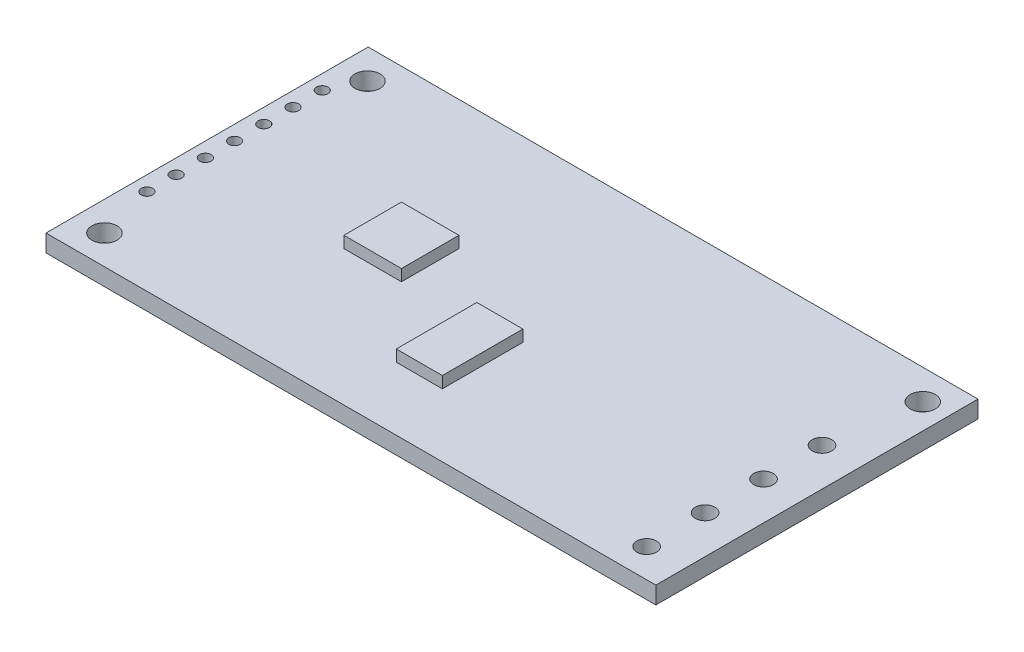
ISO-10303-21;
HEADER;
FILE_DESCRIPTION(('STEP AP214'),'2;1');
FILE_NAME('part.step','',(''),(''),'','','');
FILE_SCHEMA(('AUTOMOTIVE_DESIGN { 1 0 10303 214 1 1 1 1 }'));
ENDSEC;
DATA;
#1=APPLICATION_CONTEXT('core data for automotive mechanical design processes');
#2=APPLICATION_PROTOCOL_DEFINITION('international standard','automotive_design',2000,#1);
#3=PRODUCT_CONTEXT('',#1,'mechanical');
#4=PRODUCT('Part','Part','',(#3));
#5=PRODUCT_RELATED_PRODUCT_CATEGORY('part','',(#4));
#6=PRODUCT_DEFINITION_FORMATION('','',#4);
#7=PRODUCT_DEFINITION_CONTEXT('part definition',#1,'design');
#8=PRODUCT_DEFINITION('design','',#6,#7);
#9=PRODUCT_DEFINITION_SHAPE('','',#8);
#10=(LENGTH_UNIT() NAMED_UNIT(*) SI_UNIT(.MILLI.,.METRE.));
#11=(NAMED_UNIT(*) PLANE_ANGLE_UNIT() SI_UNIT($,.RADIAN.));
#12=(NAMED_UNIT(*) SI_UNIT($,.STERADIAN.) SOLID_ANGLE_UNIT());
#13=UNCERTAINTY_MEASURE_WITH_UNIT(LENGTH_MEASURE(1.E-05),#10,'distance_accuracy_value','');
#14=(GEOMETRIC_REPRESENTATION_CONTEXT(3) GLOBAL_UNCERTAINTY_ASSIGNED_CONTEXT((#13)) GLOBAL_UNIT_ASSIGNED_CONTEXT((#10,
#11,#12)) REPRESENTATION_CONTEXT('',''));
#15=CARTESIAN_POINT('',(0.,0.,0.));
#16=DIRECTION('',(0.,0.,1.));
#17=DIRECTION('',(1.,0.,0.));
#18=AXIS2_PLACEMENT_3D('',#15,#16,#17);
#19=CARTESIAN_POINT('',(0.,1.5,0.));
#20=DIRECTION('',(0.,-1.,0.));
#21=DIRECTION('',(0.,0.,-1.));
#22=AXIS2_PLACEMENT_3D('',#19,#20,#21);
#23=PLANE('',#22);
#24=DIRECTION('',(0.,0.,-1.));
#25=VECTOR('',#24,1.);
#26=CARTESIAN_POINT('',(-7.38162653581105,1.5,-2.77279885535369));
#27=LINE('',#26,#25);
#28=CARTESIAN_POINT('',(-7.38162653581105,1.5,2.22720114464631));
#29=VERTEX_POINT('',#28);
#30=CARTESIAN_POINT('',(-7.38162653581105,1.5,-2.77279885535369));
#31=VERTEX_POINT('',#30);
#32=EDGE_CURVE('E143',#29,#31,#27,.T.);
#33=ORIENTED_EDGE('',*,*,#32,.F.);
#34=DIRECTION('',(1.,0.,0.));
#35=VECTOR('',#34,1.);
#36=CARTESIAN_POINT('',(-12.381626535811,1.5,2.22720114464631));
#37=LINE('',#36,#35);
#38=CARTESIAN_POINT('',(-12.381626535811,1.5,2.22720114464631));
#39=VERTEX_POINT('',#38);
#40=EDGE_CURVE('E156',#39,#29,#37,.T.);
#41=ORIENTED_EDGE('',*,*,#40,.F.);
#42=DIRECTION('',(0.,0.,1.));
#43=VECTOR('',#42,1.);
#44=CARTESIAN_POINT('',(-12.381626535811,1.5,-2.77279885535369));
#45=LINE('',#44,#43);
#46=CARTESIAN_POINT('',(-12.381626535811,1.5,-2.77279885535369));
#47=VERTEX_POINT('',#46);
#48=EDGE_CURVE('E165',#47,#39,#45,.T.);
#49=ORIENTED_EDGE('',*,*,#48,.F.);
#50=DIRECTION('',(-1.,0.,0.));
#51=VECTOR('',#50,1.);
#52=CARTESIAN_POINT('',(-12.381626535811,1.5,-2.77279885535369));
#53=LINE('',#52,#51);
#54=EDGE_CURVE('E146',#31,#47,#53,.T.);
#55=ORIENTED_EDGE('',*,*,#54,.F.);
#56=EDGE_LOOP('',(#33,#41,#49,#55));
#57=FACE_BOUND('',#56,.T.);
#58=CARTESIAN_POINT('',(23.2,1.5,6.42));
#59=DIRECTION('',(0.,1.,0.));
#60=DIRECTION('',(0.,0.,1.));
#61=AXIS2_PLACEMENT_3D('',#58,#59,#60);
#62=CIRCLE('',#61,0.85);
#63=CARTESIAN_POINT('',(23.2,1.5,7.27));
#64=VERTEX_POINT('',#63);
#65=EDGE_CURVE('E184',#64,#64,#62,.T.);
#66=ORIENTED_EDGE('',*,*,#65,.F.);
#67=EDGE_LOOP('',(#66));
#68=FACE_BOUND('',#67,.T.);
#69=CARTESIAN_POINT('',(23.2,1.5,11.5));
#70=DIRECTION('',(0.,1.,0.));
#71=DIRECTION('',(0.,0.,1.));
#72=AXIS2_PLACEMENT_3D('',#69,#70,#71);
#73=CIRCLE('',#72,0.85);
#74=CARTESIAN_POINT('',(23.2,1.5,12.35));
#75=VERTEX_POINT('',#74);
#76=EDGE_CURVE('E187',#75,#75,#73,.T.);
#77=ORIENTED_EDGE('',*,*,#76,.F.);
#78=EDGE_LOOP('',(#77));
#79=FACE_BOUND('',#78,.T.);
#80=CARTESIAN_POINT('',(-25.23,1.5,-6.19981638878263));
#81=DIRECTION('',(0.,1.,0.));
#82=DIRECTION('',(0.,0.,1.));
#83=AXIS2_PLACEMENT_3D('',#80,#81,#82);
#84=CIRCLE('',#83,0.499999999999999);
#85=CARTESIAN_POINT('',(-25.23,1.5,-5.69981638878263));
#86=VERTEX_POINT('',#85);
#87=EDGE_CURVE('E196',#86,#86,#84,.T.);
#88=ORIENTED_EDGE('',*,*,#87,.F.);
#89=EDGE_LOOP('',(#88));
#90=FACE_BOUND('',#89,.T.);
#91=CARTESIAN_POINT('',(-25.23,1.5,-8.73981638878263));
#92=DIRECTION('',(0.,1.,0.));
#93=DIRECTION('',(0.,0.,1.));
#94=AXIS2_PLACEMENT_3D('',#91,#92,#93);
#95=CIRCLE('',#94,0.499999999999999);
#96=CARTESIAN_POINT('',(-25.23,1.5,-8.23981638878263));
#97=VERTEX_POINT('',#96);
#98=EDGE_CURVE('E199',#97,#97,#95,.T.);
#99=ORIENTED_EDGE('',*,*,#98,.F.);
#100=EDGE_LOOP('',(#99));
#101=FACE_BOUND('',#100,.T.);
#102=CARTESIAN_POINT('',(-23.96,1.5,-11.4));
#103=DIRECTION('',(0.,1.,0.));
#104=DIRECTION('',(0.,0.,1.));
#105=AXIS2_PLACEMENT_3D('',#102,#103,#104);
#106=CIRCLE('',#105,1.0922);
#107=CARTESIAN_POINT('',(-23.96,1.5,-10.3078));
#108=VERTEX_POINT('',#107);
#109=EDGE_CURVE('E208',#108,#108,#106,.T.);
#110=ORIENTED_EDGE('',*,*,#109,.F.);
#111=EDGE_LOOP('',(#110));
#112=FACE_BOUND('',#111,.T.);
#113=CARTESIAN_POINT('',(-23.96,1.5,11.46));
#114=DIRECTION('',(0.,1.,0.));
#115=DIRECTION('',(0.,0.,1.));
#116=AXIS2_PLACEMENT_3D('',#113,#114,#115);
#117=CIRCLE('',#116,1.0922);
#118=CARTESIAN_POINT('',(-23.96,1.5,12.5522));
#119=VERTEX_POINT('',#118);
#120=EDGE_CURVE('E211',#119,#119,#117,.T.);
#121=ORIENTED_EDGE('',*,*,#120,.F.);
#122=EDGE_LOOP('',(#121));
#123=FACE_BOUND('',#122,.T.);
#124=DIRECTION('',(0.,0.,-1.));
#125=VECTOR('',#124,1.);
#126=CARTESIAN_POINT('',(26.5,1.5,14.));
#127=LINE('',#126,#125);
#128=CARTESIAN_POINT('',(26.5,1.5,14.));
#129=VERTEX_POINT('',#128);
#130=CARTESIAN_POINT('',(26.5,1.5,-14.));
#131=VERTEX_POINT('',#130);
#132=EDGE_CURVE('E218',#129,#131,#127,.T.);
#133=ORIENTED_EDGE('',*,*,#132,.T.);
#134=DIRECTION('',(-1.,0.,0.));
#135=VECTOR('',#134,1.);
#136=CARTESIAN_POINT('',(-26.5,1.5,-14.));
#137=LINE('',#136,#135);
#138=CARTESIAN_POINT('',(-26.5,1.5,-14.));
#139=VERTEX_POINT('',#138);
#140=EDGE_CURVE('E221',#131,#139,#137,.T.);
#141=ORIENTED_EDGE('',*,*,#140,.T.);
#142=DIRECTION('',(0.,0.,1.));
#143=VECTOR('',#142,1.);
#144=CARTESIAN_POINT('',(-26.5,1.5,14.));
#145=LINE('',#144,#143);
#146=CARTESIAN_POINT('',(-26.5,1.5,14.));
#147=VERTEX_POINT('',#146);
#148=EDGE_CURVE('E224',#139,#147,#145,.T.);
#149=ORIENTED_EDGE('',*,*,#148,.T.);
#150=DIRECTION('',(1.,0.,0.));
#151=VECTOR('',#150,1.);
#152=CARTESIAN_POINT('',(-26.5,1.5,14.));
#153=LINE('',#152,#151);
#154=EDGE_CURVE('E226',#147,#129,#153,.T.);
#155=ORIENTED_EDGE('',*,*,#154,.T.);
#156=EDGE_LOOP('',(#133,#141,#149,#155));
#157=FACE_BOUND('',#156,.T.);
#158=CARTESIAN_POINT('',(24.3,1.5,-11.4));
#159=DIRECTION('',(0.,1.,0.));
#160=DIRECTION('',(0.,0.,1.));
#161=AXIS2_PLACEMENT_3D('',#158,#159,#160);
#162=CIRCLE('',#161,1.0922);
#163=CARTESIAN_POINT('',(24.3,1.5,-10.3078));
#164=VERTEX_POINT('',#163);
#165=EDGE_CURVE('E250',#164,#164,#162,.T.);
#166=ORIENTED_EDGE('',*,*,#165,.F.);
#167=EDGE_LOOP('',(#166));
#168=FACE_BOUND('',#167,.T.);
#169=CARTESIAN_POINT('',(-25.23,1.5,-3.65981638878263));
#170=DIRECTION('',(0.,1.,0.));
#171=DIRECTION('',(0.,0.,1.));
#172=AXIS2_PLACEMENT_3D('',#169,#170,#171);
#173=CIRCLE('',#172,0.499999999999999);
#174=CARTESIAN_POINT('',(-25.23,1.5,-3.15981638878263));
#175=VERTEX_POINT('',#174);
#176=EDGE_CURVE('E256',#175,#175,#173,.T.);
#177=ORIENTED_EDGE('',*,*,#176,.F.);
#178=EDGE_LOOP('',(#177));
#179=FACE_BOUND('',#178,.T.);
#180=CARTESIAN_POINT('',(-25.23,1.5,-1.11981638878263));
#181=DIRECTION('',(0.,1.,0.));
#182=DIRECTION('',(0.,0.,1.));
#183=AXIS2_PLACEMENT_3D('',#180,#181,#182);
#184=CIRCLE('',#183,0.499999999999999);
#185=CARTESIAN_POINT('',(-25.23,1.5,-0.619816388782629));
#186=VERTEX_POINT('',#185);
#187=EDGE_CURVE('E262',#186,#186,#184,.T.);
#188=ORIENTED_EDGE('',*,*,#187,.F.);
#189=EDGE_LOOP('',(#188));
#190=FACE_BOUND('',#189,.T.);
#191=CARTESIAN_POINT('',(-25.23,1.5,1.42018361121737));
#192=DIRECTION('',(0.,1.,0.));
#193=DIRECTION('',(0.,0.,1.));
#194=AXIS2_PLACEMENT_3D('',#191,#192,#193);
#195=CIRCLE('',#194,0.499999999999999);
#196=CARTESIAN_POINT('',(-25.23,1.5,1.92018361121737));
#197=VERTEX_POINT('',#196);
#198=EDGE_CURVE('E268',#197,#197,#195,.T.);
#199=ORIENTED_EDGE('',*,*,#198,.F.);
#200=EDGE_LOOP('',(#199));
#201=FACE_BOUND('',#200,.T.);
#202=CARTESIAN_POINT('',(-25.23,1.5,3.96018361121737));
#203=DIRECTION('',(0.,1.,0.));
#204=DIRECTION('',(0.,0.,1.));
#205=AXIS2_PLACEMENT_3D('',#202,#203,#204);
#206=CIRCLE('',#205,0.499999999999999);
#207=CARTESIAN_POINT('',(-25.23,1.5,4.46018361121737));
#208=VERTEX_POINT('',#207);
#209=EDGE_CURVE('E274',#208,#208,#206,.T.);
#210=ORIENTED_EDGE('',*,*,#209,.F.);
#211=EDGE_LOOP('',(#210));
#212=FACE_BOUND('',#211,.T.);
#213=CARTESIAN_POINT('',(-25.23,1.5,6.50018361121737));
#214=DIRECTION('',(0.,1.,0.));
#215=DIRECTION('',(0.,0.,1.));
#216=AXIS2_PLACEMENT_3D('',#213,#214,#215);
#217=CIRCLE('',#216,0.499999999999999);
#218=CARTESIAN_POINT('',(-25.23,1.5,7.00018361121737));
#219=VERTEX_POINT('',#218);
#220=EDGE_CURVE('E280',#219,#219,#217,.T.);
#221=ORIENTED_EDGE('',*,*,#220,.F.);
#222=EDGE_LOOP('',(#221));
#223=FACE_BOUND('',#222,.T.);
#224=CARTESIAN_POINT('',(23.2,1.5,1.34));
#225=DIRECTION('',(0.,1.,0.));
#226=DIRECTION('',(0.,0.,1.));
#227=AXIS2_PLACEMENT_3D('',#224,#225,#226);
#228=CIRCLE('',#227,0.85);
#229=CARTESIAN_POINT('',(23.2,1.5,2.19));
#230=VERTEX_POINT('',#229);
#231=EDGE_CURVE('E286',#230,#230,#228,.T.);
#232=ORIENTED_EDGE('',*,*,#231,.F.);
#233=EDGE_LOOP('',(#232));
#234=FACE_BOUND('',#233,.T.);
#235=CARTESIAN_POINT('',(23.2,1.5,-3.74));
#236=DIRECTION('',(0.,1.,0.));
#237=DIRECTION('',(0.,0.,1.));
#238=AXIS2_PLACEMENT_3D('',#235,#236,#237);
#239=CIRCLE('',#238,0.85);
#240=CARTESIAN_POINT('',(23.2,1.5,-2.89));
#241=VERTEX_POINT('',#240);
#242=EDGE_CURVE('E11',#241,#241,#239,.T.);
#243=ORIENTED_EDGE('',*,*,#242,.F.);
#244=EDGE_LOOP('',(#243));
#245=FACE_BOUND('',#244,.T.);
#246=DIRECTION('',(0.,0.,-1.));
#247=VECTOR('',#246,1.);
#248=CARTESIAN_POINT('',(2.4505624846841,1.5,1.50445593668608));
#249=LINE('',#248,#247);
#250=CARTESIAN_POINT('',(2.4505624846841,1.5,8.50445593668608));
#251=VERTEX_POINT('',#250);
#252=CARTESIAN_POINT('',(2.4505624846841,1.5,1.50445593668608));
#253=VERTEX_POINT('',#252);
#254=EDGE_CURVE('E142',#251,#253,#249,.T.);
#255=ORIENTED_EDGE('',*,*,#254,.F.);
#256=DIRECTION('',(1.,0.,0.));
#257=VECTOR('',#256,1.);
#258=CARTESIAN_POINT('',(-1.5494375153159,1.5,8.50445593668608));
#259=LINE('',#258,#257);
#260=CARTESIAN_POINT('',(-1.5494375153159,1.5,8.50445593668608));
#261=VERTEX_POINT('',#260);
#262=EDGE_CURVE('E139',#261,#251,#259,.T.);
#263=ORIENTED_EDGE('',*,*,#262,.F.);
#264=DIRECTION('',(0.,0.,1.));
#265=VECTOR('',#264,1.);
#266=CARTESIAN_POINT('',(-1.5494375153159,1.5,1.50445593668608));
#267=LINE('',#266,#265);
#268=CARTESIAN_POINT('',(-1.5494375153159,1.5,1.50445593668608));
#269=VERTEX_POINT('',#268);
#270=EDGE_CURVE('E53',#269,#261,#267,.T.);
#271=ORIENTED_EDGE('',*,*,#270,.F.);
#272=DIRECTION('',(-1.,0.,0.));
#273=VECTOR('',#272,1.);
#274=CARTESIAN_POINT('',(-1.5494375153159,1.5,1.50445593668608));
#275=LINE('',#274,#273);
#276=EDGE_CURVE('E48',#253,#269,#275,.T.);
#277=ORIENTED_EDGE('',*,*,#276,.F.);
#278=EDGE_LOOP('',(#255,#263,#271,#277));
#279=FACE_BOUND('',#278,.T.);
#280=ADVANCED_FACE('F33',(#57,#68,#79,#90,#101,#112,#123,#157,#168,#179,#190,#201,#212,#223,
#234,#245,#279),#23,.F.);
#281=CARTESIAN_POINT('',(26.5,1.5,14.));
#282=DIRECTION('',(-1.,0.,0.));
#283=DIRECTION('',(0.,0.,1.));
#284=AXIS2_PLACEMENT_3D('',#281,#282,#283);
#285=PLANE('',#284);
#286=DIRECTION('',(0.,0.,-1.));
#287=VECTOR('',#286,1.);
#288=CARTESIAN_POINT('',(26.5,0.,14.));
#289=LINE('',#288,#287);
#290=CARTESIAN_POINT('',(26.5,0.,14.));
#291=VERTEX_POINT('',#290);
#292=CARTESIAN_POINT('',(26.5,0.,-14.));
#293=VERTEX_POINT('',#292);
#294=EDGE_CURVE('E215',#291,#293,#289,.T.);
#295=ORIENTED_EDGE('',*,*,#294,.T.);
#296=DIRECTION('',(0.,-1.,0.));
#297=VECTOR('',#296,1.);
#298=CARTESIAN_POINT('',(26.5,1.5,-14.));
#299=LINE('',#298,#297);
#300=EDGE_CURVE('E244',#131,#293,#299,.T.);
#301=ORIENTED_EDGE('',*,*,#300,.F.);
#302=ORIENTED_EDGE('',*,*,#132,.F.);
#303=DIRECTION('',(0.,-1.,0.));
#304=VECTOR('',#303,1.);
#305=CARTESIAN_POINT('',(26.5,1.5,14.));
#306=LINE('',#305,#304);
#307=EDGE_CURVE('E228',#129,#291,#306,.T.);
#308=ORIENTED_EDGE('',*,*,#307,.T.);
#309=EDGE_LOOP('',(#295,#301,#302,#308));
#310=FACE_BOUND('',#309,.T.);
#311=ADVANCED_FACE('F300',(#310),#285,.F.);
#312=CARTESIAN_POINT('',(-26.5,1.5,-14.));
#313=DIRECTION('',(0.,0.,1.));
#314=DIRECTION('',(1.,0.,0.));
#315=AXIS2_PLACEMENT_3D('',#312,#313,#314);
#316=PLANE('',#315);
#317=DIRECTION('',(-1.,0.,0.));
#318=VECTOR('',#317,1.);
#319=CARTESIAN_POINT('',(-26.5,0.,-14.));
#320=LINE('',#319,#318);
#321=CARTESIAN_POINT('',(-26.5,0.,-14.));
#322=VERTEX_POINT('',#321);
#323=EDGE_CURVE('E231',#293,#322,#320,.T.);
#324=ORIENTED_EDGE('',*,*,#323,.T.);
#325=DIRECTION('',(0.,-1.,0.));
#326=VECTOR('',#325,1.);
#327=CARTESIAN_POINT('',(-26.5,1.5,-14.));
#328=LINE('',#327,#326);
#329=EDGE_CURVE('E241',#139,#322,#328,.T.);
#330=ORIENTED_EDGE('',*,*,#329,.F.);
#331=ORIENTED_EDGE('',*,*,#140,.F.);
#332=ORIENTED_EDGE('',*,*,#300,.T.);
#333=EDGE_LOOP('',(#324,#330,#331,#332));
#334=FACE_BOUND('',#333,.T.);
#335=ADVANCED_FACE('F386',(#334),#316,.F.);
#336=CARTESIAN_POINT('',(-26.5,1.5,14.));
#337=DIRECTION('',(1.,0.,0.));
#338=DIRECTION('',(0.,0.,-1.));
#339=AXIS2_PLACEMENT_3D('',#336,#337,#338);
#340=PLANE('',#339);
#341=DIRECTION('',(0.,0.,1.));
#342=VECTOR('',#341,1.);
#343=CARTESIAN_POINT('',(-26.5,0.,14.));
#344=LINE('',#343,#342);
#345=CARTESIAN_POINT('',(-26.5,0.,14.));
#346=VERTEX_POINT('',#345);
#347=EDGE_CURVE('E233',#322,#346,#344,.T.);
#348=ORIENTED_EDGE('',*,*,#347,.T.);
#349=DIRECTION('',(0.,-1.,0.));
#350=VECTOR('',#349,1.);
#351=CARTESIAN_POINT('',(-26.5,1.5,14.));
#352=LINE('',#351,#350);
#353=EDGE_CURVE('E238',#147,#346,#352,.T.);
#354=ORIENTED_EDGE('',*,*,#353,.F.);
#355=ORIENTED_EDGE('',*,*,#148,.F.);
#356=ORIENTED_EDGE('',*,*,#329,.T.);
#357=EDGE_LOOP('',(#348,#354,#355,#356));
#358=FACE_BOUND('',#357,.T.);
#359=ADVANCED_FACE('F382',(#358),#340,.F.);
#360=CARTESIAN_POINT('',(-26.5,1.5,14.));
#361=DIRECTION('',(0.,0.,-1.));
#362=DIRECTION('',(-1.,0.,0.));
#363=AXIS2_PLACEMENT_3D('',#360,#361,#362);
#364=PLANE('',#363);
#365=DIRECTION('',(1.,0.,0.));
#366=VECTOR('',#365,1.);
#367=CARTESIAN_POINT('',(-26.5,0.,14.));
#368=LINE('',#367,#366);
#369=EDGE_CURVE('E222',#346,#291,#368,.T.);
#370=ORIENTED_EDGE('',*,*,#369,.T.);
#371=ORIENTED_EDGE('',*,*,#307,.F.);
#372=ORIENTED_EDGE('',*,*,#154,.F.);
#373=ORIENTED_EDGE('',*,*,#353,.T.);
#374=EDGE_LOOP('',(#370,#371,#372,#373));
#375=FACE_BOUND('',#374,.T.);
#376=ADVANCED_FACE('F378',(#375),#364,.F.);
#377=CARTESIAN_POINT('',(0.,0.,0.));
#378=DIRECTION('',(0.,-1.,0.));
#379=DIRECTION('',(0.,0.,-1.));
#380=AXIS2_PLACEMENT_3D('',#377,#378,#379);
#381=PLANE('',#380);
#382=CARTESIAN_POINT('',(23.2,0.,6.42));
#383=DIRECTION('',(0.,1.,0.));
#384=DIRECTION('',(0.,0.,1.));
#385=AXIS2_PLACEMENT_3D('',#382,#383,#384);
#386=CIRCLE('',#385,0.85);
#387=CARTESIAN_POINT('',(23.2,0.,7.27));
#388=VERTEX_POINT('',#387);
#389=EDGE_CURVE('E181',#388,#388,#386,.T.);
#390=ORIENTED_EDGE('',*,*,#389,.T.);
#391=EDGE_LOOP('',(#390));
#392=FACE_BOUND('',#391,.T.);
#393=CARTESIAN_POINT('',(23.2,0.,11.5));
#394=DIRECTION('',(0.,1.,0.));
#395=DIRECTION('',(0.,0.,1.));
#396=AXIS2_PLACEMENT_3D('',#393,#394,#395);
#397=CIRCLE('',#396,0.85);
#398=CARTESIAN_POINT('',(23.2,0.,12.35));
#399=VERTEX_POINT('',#398);
#400=EDGE_CURVE('E188',#399,#399,#397,.T.);
#401=ORIENTED_EDGE('',*,*,#400,.T.);
#402=EDGE_LOOP('',(#401));
#403=FACE_BOUND('',#402,.T.);
#404=CARTESIAN_POINT('',(-25.23,0.,-6.19981638878263));
#405=DIRECTION('',(0.,1.,0.));
#406=DIRECTION('',(0.,0.,1.));
#407=AXIS2_PLACEMENT_3D('',#404,#405,#406);
#408=CIRCLE('',#407,0.499999999999999);
#409=CARTESIAN_POINT('',(-25.23,0.,-5.69981638878263));
#410=VERTEX_POINT('',#409);
#411=EDGE_CURVE('E191',#410,#410,#408,.T.);
#412=ORIENTED_EDGE('',*,*,#411,.T.);
#413=EDGE_LOOP('',(#412));
#414=FACE_BOUND('',#413,.T.);
#415=CARTESIAN_POINT('',(-25.23,0.,-8.73981638878263));
#416=DIRECTION('',(0.,1.,0.));
#417=DIRECTION('',(0.,0.,1.));
#418=AXIS2_PLACEMENT_3D('',#415,#416,#417);
#419=CIRCLE('',#418,0.499999999999999);
#420=CARTESIAN_POINT('',(-25.23,0.,-8.23981638878263));
#421=VERTEX_POINT('',#420);
#422=EDGE_CURVE('E200',#421,#421,#419,.T.);
#423=ORIENTED_EDGE('',*,*,#422,.T.);
#424=EDGE_LOOP('',(#423));
#425=FACE_BOUND('',#424,.T.);
#426=CARTESIAN_POINT('',(-23.96,0.,-11.4));
#427=DIRECTION('',(0.,1.,0.));
#428=DIRECTION('',(0.,0.,1.));
#429=AXIS2_PLACEMENT_3D('',#426,#427,#428);
#430=CIRCLE('',#429,1.0922);
#431=CARTESIAN_POINT('',(-23.96,0.,-10.3078));
#432=VERTEX_POINT('',#431);
#433=EDGE_CURVE('E203',#432,#432,#430,.T.);
#434=ORIENTED_EDGE('',*,*,#433,.T.);
#435=EDGE_LOOP('',(#434));
#436=FACE_BOUND('',#435,.T.);
#437=CARTESIAN_POINT('',(-23.96,0.,11.46));
#438=DIRECTION('',(0.,1.,0.));
#439=DIRECTION('',(0.,0.,1.));
#440=AXIS2_PLACEMENT_3D('',#437,#438,#439);
#441=CIRCLE('',#440,1.0922);
#442=CARTESIAN_POINT('',(-23.96,0.,12.5522));
#443=VERTEX_POINT('',#442);
#444=EDGE_CURVE('E212',#443,#443,#441,.T.);
#445=ORIENTED_EDGE('',*,*,#444,.T.);
#446=EDGE_LOOP('',(#445));
#447=FACE_BOUND('',#446,.T.);
#448=ORIENTED_EDGE('',*,*,#294,.F.);
#449=ORIENTED_EDGE('',*,*,#369,.F.);
#450=ORIENTED_EDGE('',*,*,#347,.F.);
#451=ORIENTED_EDGE('',*,*,#323,.F.);
#452=EDGE_LOOP('',(#448,#449,#450,#451));
#453=FACE_BOUND('',#452,.T.);
#454=CARTESIAN_POINT('',(24.3,0.,-11.4));
#455=DIRECTION('',(0.,1.,0.));
#456=DIRECTION('',(0.,0.,1.));
#457=AXIS2_PLACEMENT_3D('',#454,#455,#456);
#458=CIRCLE('',#457,1.0922);
#459=CARTESIAN_POINT('',(24.3,0.,-10.3078));
#460=VERTEX_POINT('',#459);
#461=EDGE_CURVE('E247',#460,#460,#458,.T.);
#462=ORIENTED_EDGE('',*,*,#461,.T.);
#463=EDGE_LOOP('',(#462));
#464=FACE_BOUND('',#463,.T.);
#465=CARTESIAN_POINT('',(-25.23,0.,-3.65981638878263));
#466=DIRECTION('',(0.,1.,0.));
#467=DIRECTION('',(0.,0.,1.));
#468=AXIS2_PLACEMENT_3D('',#465,#466,#467);
#469=CIRCLE('',#468,0.499999999999999);
#470=CARTESIAN_POINT('',(-25.23,0.,-3.15981638878263));
#471=VERTEX_POINT('',#470);
#472=EDGE_CURVE('E253',#471,#471,#469,.T.);
#473=ORIENTED_EDGE('',*,*,#472,.T.);
#474=EDGE_LOOP('',(#473));
#475=FACE_BOUND('',#474,.T.);
#476=CARTESIAN_POINT('',(-25.23,0.,-1.11981638878263));
#477=DIRECTION('',(0.,1.,0.));
#478=DIRECTION('',(0.,0.,1.));
#479=AXIS2_PLACEMENT_3D('',#476,#477,#478);
#480=CIRCLE('',#479,0.499999999999999);
#481=CARTESIAN_POINT('',(-25.23,0.,-0.619816388782629));
#482=VERTEX_POINT('',#481);
#483=EDGE_CURVE('E259',#482,#482,#480,.T.);
#484=ORIENTED_EDGE('',*,*,#483,.T.);
#485=EDGE_LOOP('',(#484));
#486=FACE_BOUND('',#485,.T.);
#487=CARTESIAN_POINT('',(-25.23,0.,1.42018361121737));
#488=DIRECTION('',(0.,1.,0.));
#489=DIRECTION('',(0.,0.,1.));
#490=AXIS2_PLACEMENT_3D('',#487,#488,#489);
#491=CIRCLE('',#490,0.499999999999999);
#492=CARTESIAN_POINT('',(-25.23,0.,1.92018361121737));
#493=VERTEX_POINT('',#492);
#494=EDGE_CURVE('E265',#493,#493,#491,.T.);
#495=ORIENTED_EDGE('',*,*,#494,.T.);
#496=EDGE_LOOP('',(#495));
#497=FACE_BOUND('',#496,.T.);
#498=CARTESIAN_POINT('',(-25.23,0.,3.96018361121737));
#499=DIRECTION('',(0.,1.,0.));
#500=DIRECTION('',(0.,0.,1.));
#501=AXIS2_PLACEMENT_3D('',#498,#499,#500);
#502=CIRCLE('',#501,0.499999999999999);
#503=CARTESIAN_POINT('',(-25.23,0.,4.46018361121737));
#504=VERTEX_POINT('',#503);
#505=EDGE_CURVE('E271',#504,#504,#502,.T.);
#506=ORIENTED_EDGE('',*,*,#505,.T.);
#507=EDGE_LOOP('',(#506));
#508=FACE_BOUND('',#507,.T.);
#509=CARTESIAN_POINT('',(-25.23,0.,6.50018361121737));
#510=DIRECTION('',(0.,1.,0.));
#511=DIRECTION('',(0.,0.,1.));
#512=AXIS2_PLACEMENT_3D('',#509,#510,#511);
#513=CIRCLE('',#512,0.499999999999999);
#514=CARTESIAN_POINT('',(-25.23,0.,7.00018361121737));
#515=VERTEX_POINT('',#514);
#516=EDGE_CURVE('E277',#515,#515,#513,.T.);
#517=ORIENTED_EDGE('',*,*,#516,.T.);
#518=EDGE_LOOP('',(#517));
#519=FACE_BOUND('',#518,.T.);
#520=CARTESIAN_POINT('',(23.2,0.,1.34));
#521=DIRECTION('',(0.,1.,0.));
#522=DIRECTION('',(0.,0.,1.));
#523=AXIS2_PLACEMENT_3D('',#520,#521,#522);
#524=CIRCLE('',#523,0.85);
#525=CARTESIAN_POINT('',(23.2,0.,2.19));
#526=VERTEX_POINT('',#525);
#527=EDGE_CURVE('E283',#526,#526,#524,.T.);
#528=ORIENTED_EDGE('',*,*,#527,.T.);
#529=EDGE_LOOP('',(#528));
#530=FACE_BOUND('',#529,.T.);
#531=CARTESIAN_POINT('',(23.2,0.,-3.74));
#532=DIRECTION('',(0.,1.,0.));
#533=DIRECTION('',(0.,0.,1.));
#534=AXIS2_PLACEMENT_3D('',#531,#532,#533);
#535=CIRCLE('',#534,0.85);
#536=CARTESIAN_POINT('',(23.2,0.,-2.89));
#537=VERTEX_POINT('',#536);
#538=EDGE_CURVE('E41',#537,#537,#535,.T.);
#539=ORIENTED_EDGE('',*,*,#538,.T.);
#540=EDGE_LOOP('',(#539));
#541=FACE_BOUND('',#540,.T.);
#542=ADVANCED_FACE('F291',(#392,#403,#414,#425,#436,#447,#453,#464,#475,#486,#497,#508,#519,
#530,#541),#381,.T.);
#543=CARTESIAN_POINT('',(-23.96,0.,11.46));
#544=DIRECTION('',(0.,1.,0.));
#545=DIRECTION('',(0.,0.,1.));
#546=AXIS2_PLACEMENT_3D('',#543,#544,#545);
#547=CYLINDRICAL_SURFACE('',#546,1.0922);
#548=ORIENTED_EDGE('',*,*,#444,.F.);
#549=EDGE_LOOP('',(#548));
#550=FACE_BOUND('',#549,.T.);
#551=ORIENTED_EDGE('',*,*,#120,.T.);
#552=EDGE_LOOP('',(#551));
#553=FACE_BOUND('',#552,.T.);
#554=ADVANCED_FACE('F371',(#550,#553),#547,.F.);
#555=CARTESIAN_POINT('',(-23.96,0.,-11.4));
#556=DIRECTION('',(0.,1.,0.));
#557=DIRECTION('',(0.,0.,1.));
#558=AXIS2_PLACEMENT_3D('',#555,#556,#557);
#559=CYLINDRICAL_SURFACE('',#558,1.0922);
#560=ORIENTED_EDGE('',*,*,#433,.F.);
#561=EDGE_LOOP('',(#560));
#562=FACE_BOUND('',#561,.T.);
#563=ORIENTED_EDGE('',*,*,#109,.T.);
#564=EDGE_LOOP('',(#563));
#565=FACE_BOUND('',#564,.T.);
#566=ADVANCED_FACE('F368',(#562,#565),#559,.F.);
#567=CARTESIAN_POINT('',(24.3,0.,-11.4));
#568=DIRECTION('',(0.,1.,0.));
#569=DIRECTION('',(0.,0.,1.));
#570=AXIS2_PLACEMENT_3D('',#567,#568,#569);
#571=CYLINDRICAL_SURFACE('',#570,1.0922);
#572=ORIENTED_EDGE('',*,*,#461,.F.);
#573=EDGE_LOOP('',(#572));
#574=FACE_BOUND('',#573,.T.);
#575=ORIENTED_EDGE('',*,*,#165,.T.);
#576=EDGE_LOOP('',(#575));
#577=FACE_BOUND('',#576,.T.);
#578=ADVANCED_FACE('F366',(#574,#577),#571,.F.);
#579=CARTESIAN_POINT('',(-25.23,0.,-8.73981638878263));
#580=DIRECTION('',(0.,1.,0.));
#581=DIRECTION('',(0.,0.,1.));
#582=AXIS2_PLACEMENT_3D('',#579,#580,#581);
#583=CYLINDRICAL_SURFACE('',#582,0.499999999999999);
#584=ORIENTED_EDGE('',*,*,#422,.F.);
#585=EDGE_LOOP('',(#584));
#586=FACE_BOUND('',#585,.T.);
#587=ORIENTED_EDGE('',*,*,#98,.T.);
#588=EDGE_LOOP('',(#587));
#589=FACE_BOUND('',#588,.T.);
#590=ADVANCED_FACE('F362',(#586,#589),#583,.F.);
#591=CARTESIAN_POINT('',(-25.23,0.,-6.19981638878263));
#592=DIRECTION('',(0.,1.,0.));
#593=DIRECTION('',(0.,0.,1.));
#594=AXIS2_PLACEMENT_3D('',#591,#592,#593);
#595=CYLINDRICAL_SURFACE('',#594,0.499999999999999);
#596=ORIENTED_EDGE('',*,*,#411,.F.);
#597=EDGE_LOOP('',(#596));
#598=FACE_BOUND('',#597,.T.);
#599=ORIENTED_EDGE('',*,*,#87,.T.);
#600=EDGE_LOOP('',(#599));
#601=FACE_BOUND('',#600,.T.);
#602=ADVANCED_FACE('F358',(#598,#601),#595,.F.);
#603=CARTESIAN_POINT('',(-25.23,0.,-3.65981638878263));
#604=DIRECTION('',(0.,1.,0.));
#605=DIRECTION('',(0.,0.,1.));
#606=AXIS2_PLACEMENT_3D('',#603,#604,#605);
#607=CYLINDRICAL_SURFACE('',#606,0.499999999999999);
#608=ORIENTED_EDGE('',*,*,#472,.F.);
#609=EDGE_LOOP('',(#608));
#610=FACE_BOUND('',#609,.T.);
#611=ORIENTED_EDGE('',*,*,#176,.T.);
#612=EDGE_LOOP('',(#611));
#613=FACE_BOUND('',#612,.T.);
#614=ADVANCED_FACE('F361',(#610,#613),#607,.F.);
#615=CARTESIAN_POINT('',(-25.23,0.,-1.11981638878263));
#616=DIRECTION('',(0.,1.,0.));
#617=DIRECTION('',(0.,0.,1.));
#618=AXIS2_PLACEMENT_3D('',#615,#616,#617);
#619=CYLINDRICAL_SURFACE('',#618,0.499999999999999);
#620=ORIENTED_EDGE('',*,*,#483,.F.);
#621=EDGE_LOOP('',(#620));
#622=FACE_BOUND('',#621,.T.);
#623=ORIENTED_EDGE('',*,*,#187,.T.);
#624=EDGE_LOOP('',(#623));
#625=FACE_BOUND('',#624,.T.);
#626=ADVANCED_FACE('F399',(#622,#625),#619,.F.);
#627=CARTESIAN_POINT('',(-25.23,0.,1.42018361121737));
#628=DIRECTION('',(0.,1.,0.));
#629=DIRECTION('',(0.,0.,1.));
#630=AXIS2_PLACEMENT_3D('',#627,#628,#629);
#631=CYLINDRICAL_SURFACE('',#630,0.499999999999999);
#632=ORIENTED_EDGE('',*,*,#494,.F.);
#633=EDGE_LOOP('',(#632));
#634=FACE_BOUND('',#633,.T.);
#635=ORIENTED_EDGE('',*,*,#198,.T.);
#636=EDGE_LOOP('',(#635));
#637=FACE_BOUND('',#636,.T.);
#638=ADVANCED_FACE('F403',(#634,#637),#631,.F.);
#639=CARTESIAN_POINT('',(-25.23,0.,3.96018361121737));
#640=DIRECTION('',(0.,1.,0.));
#641=DIRECTION('',(0.,0.,1.));
#642=AXIS2_PLACEMENT_3D('',#639,#640,#641);
#643=CYLINDRICAL_SURFACE('',#642,0.499999999999999);
#644=ORIENTED_EDGE('',*,*,#505,.F.);
#645=EDGE_LOOP('',(#644));
#646=FACE_BOUND('',#645,.T.);
#647=ORIENTED_EDGE('',*,*,#209,.T.);
#648=EDGE_LOOP('',(#647));
#649=FACE_BOUND('',#648,.T.);
#650=ADVANCED_FACE('F407',(#646,#649),#643,.F.);
#651=CARTESIAN_POINT('',(-25.23,0.,6.50018361121737));
#652=DIRECTION('',(0.,1.,0.));
#653=DIRECTION('',(0.,0.,1.));
#654=AXIS2_PLACEMENT_3D('',#651,#652,#653);
#655=CYLINDRICAL_SURFACE('',#654,0.499999999999999);
#656=ORIENTED_EDGE('',*,*,#516,.F.);
#657=EDGE_LOOP('',(#656));
#658=FACE_BOUND('',#657,.T.);
#659=ORIENTED_EDGE('',*,*,#220,.T.);
#660=EDGE_LOOP('',(#659));
#661=FACE_BOUND('',#660,.T.);
#662=ADVANCED_FACE('F356',(#658,#661),#655,.F.);
#663=CARTESIAN_POINT('',(23.2,0.,11.5));
#664=DIRECTION('',(0.,1.,0.));
#665=DIRECTION('',(0.,0.,1.));
#666=AXIS2_PLACEMENT_3D('',#663,#664,#665);
#667=CYLINDRICAL_SURFACE('',#666,0.85);
#668=ORIENTED_EDGE('',*,*,#400,.F.);
#669=EDGE_LOOP('',(#668));
#670=FACE_BOUND('',#669,.T.);
#671=ORIENTED_EDGE('',*,*,#76,.T.);
#672=EDGE_LOOP('',(#671));
#673=FACE_BOUND('',#672,.T.);
#674=ADVANCED_FACE('F352',(#670,#673),#667,.F.);
#675=CARTESIAN_POINT('',(23.2,0.,6.42));
#676=DIRECTION('',(0.,1.,0.));
#677=DIRECTION('',(0.,0.,1.));
#678=AXIS2_PLACEMENT_3D('',#675,#676,#677);
#679=CYLINDRICAL_SURFACE('',#678,0.85);
#680=ORIENTED_EDGE('',*,*,#389,.F.);
#681=EDGE_LOOP('',(#680));
#682=FACE_BOUND('',#681,.T.);
#683=ORIENTED_EDGE('',*,*,#65,.T.);
#684=EDGE_LOOP('',(#683));
#685=FACE_BOUND('',#684,.T.);
#686=ADVANCED_FACE('F349',(#682,#685),#679,.F.);
#687=CARTESIAN_POINT('',(23.2,0.,1.34));
#688=DIRECTION('',(0.,1.,0.));
#689=DIRECTION('',(0.,0.,1.));
#690=AXIS2_PLACEMENT_3D('',#687,#688,#689);
#691=CYLINDRICAL_SURFACE('',#690,0.85);
#692=ORIENTED_EDGE('',*,*,#527,.F.);
#693=EDGE_LOOP('',(#692));
#694=FACE_BOUND('',#693,.T.);
#695=ORIENTED_EDGE('',*,*,#231,.T.);
#696=EDGE_LOOP('',(#695));
#697=FACE_BOUND('',#696,.T.);
#698=ADVANCED_FACE('F296',(#694,#697),#691,.F.);
#699=CARTESIAN_POINT('',(23.2,0.,-3.74));
#700=DIRECTION('',(0.,1.,0.));
#701=DIRECTION('',(0.,0.,1.));
#702=AXIS2_PLACEMENT_3D('',#699,#700,#701);
#703=CYLINDRICAL_SURFACE('',#702,0.85);
#704=ORIENTED_EDGE('',*,*,#538,.F.);
#705=EDGE_LOOP('',(#704));
#706=FACE_BOUND('',#705,.T.);
#707=ORIENTED_EDGE('',*,*,#242,.T.);
#708=EDGE_LOOP('',(#707));
#709=FACE_BOUND('',#708,.T.);
#710=ADVANCED_FACE('F35',(#706,#709),#703,.F.);
#711=CARTESIAN_POINT('',(-7.38162653581105,2.5,-2.77279885535369));
#712=DIRECTION('',(-1.,0.,0.));
#713=DIRECTION('',(0.,0.,1.));
#714=AXIS2_PLACEMENT_3D('',#711,#712,#713);
#715=PLANE('',#714);
#716=ORIENTED_EDGE('',*,*,#32,.T.);
#717=DIRECTION('',(0.,-1.,0.));
#718=VECTOR('',#717,1.);
#719=CARTESIAN_POINT('',(-7.38162653581105,2.5,-2.77279885535369));
#720=LINE('',#719,#718);
#721=CARTESIAN_POINT('',(-7.38162653581105,2.5,-2.77279885535369));
#722=VERTEX_POINT('',#721);
#723=EDGE_CURVE('E178',#722,#31,#720,.T.);
#724=ORIENTED_EDGE('',*,*,#723,.F.);
#725=DIRECTION('',(0.,0.,-1.));
#726=VECTOR('',#725,1.);
#727=CARTESIAN_POINT('',(-7.38162653581105,2.5,-2.77279885535369));
#728=LINE('',#727,#726);
#729=CARTESIAN_POINT('',(-7.38162653581105,2.5,2.22720114464631));
#730=VERTEX_POINT('',#729);
#731=EDGE_CURVE('E152',#730,#722,#728,.T.);
#732=ORIENTED_EDGE('',*,*,#731,.F.);
#733=DIRECTION('',(0.,-1.,0.));
#734=VECTOR('',#733,1.);
#735=CARTESIAN_POINT('',(-7.38162653581105,2.5,2.22720114464631));
#736=LINE('',#735,#734);
#737=EDGE_CURVE('E161',#730,#29,#736,.T.);
#738=ORIENTED_EDGE('',*,*,#737,.T.);
#739=EDGE_LOOP('',(#716,#724,#732,#738));
#740=FACE_BOUND('',#739,.T.);
#741=ADVANCED_FACE('F295',(#740),#715,.F.);
#742=CARTESIAN_POINT('',(-12.381626535811,2.5,-2.77279885535369));
#743=DIRECTION('',(0.,0.,1.));
#744=DIRECTION('',(1.,0.,0.));
#745=AXIS2_PLACEMENT_3D('',#742,#743,#744);
#746=PLANE('',#745);
#747=ORIENTED_EDGE('',*,*,#54,.T.);
#748=DIRECTION('',(0.,-1.,0.));
#749=VECTOR('',#748,1.);
#750=CARTESIAN_POINT('',(-12.381626535811,2.5,-2.77279885535369));
#751=LINE('',#750,#749);
#752=CARTESIAN_POINT('',(-12.381626535811,2.5,-2.77279885535369));
#753=VERTEX_POINT('',#752);
#754=EDGE_CURVE('E175',#753,#47,#751,.T.);
#755=ORIENTED_EDGE('',*,*,#754,.F.);
#756=DIRECTION('',(-1.,0.,0.));
#757=VECTOR('',#756,1.);
#758=CARTESIAN_POINT('',(-12.381626535811,2.5,-2.77279885535369));
#759=LINE('',#758,#757);
#760=EDGE_CURVE('E155',#722,#753,#759,.T.);
#761=ORIENTED_EDGE('',*,*,#760,.F.);
#762=ORIENTED_EDGE('',*,*,#723,.T.);
#763=EDGE_LOOP('',(#747,#755,#761,#762));
#764=FACE_BOUND('',#763,.T.);
#765=ADVANCED_FACE('F341',(#764),#746,.F.);
#766=CARTESIAN_POINT('',(-12.381626535811,2.5,-2.77279885535369));
#767=DIRECTION('',(1.,0.,0.));
#768=DIRECTION('',(0.,0.,-1.));
#769=AXIS2_PLACEMENT_3D('',#766,#767,#768);
#770=PLANE('',#769);
#771=ORIENTED_EDGE('',*,*,#48,.T.);
#772=DIRECTION('',(0.,-1.,0.));
#773=VECTOR('',#772,1.);
#774=CARTESIAN_POINT('',(-12.381626535811,2.5,2.22720114464631));
#775=LINE('',#774,#773);
#776=CARTESIAN_POINT('',(-12.381626535811,2.5,2.22720114464631));
#777=VERTEX_POINT('',#776);
#778=EDGE_CURVE('E172',#777,#39,#775,.T.);
#779=ORIENTED_EDGE('',*,*,#778,.F.);
#780=DIRECTION('',(0.,0.,1.));
#781=VECTOR('',#780,1.);
#782=CARTESIAN_POINT('',(-12.381626535811,2.5,-2.77279885535369));
#783=LINE('',#782,#781);
#784=EDGE_CURVE('E158',#753,#777,#783,.T.);
#785=ORIENTED_EDGE('',*,*,#784,.F.);
#786=ORIENTED_EDGE('',*,*,#754,.T.);
#787=EDGE_LOOP('',(#771,#779,#785,#786));
#788=FACE_BOUND('',#787,.T.);
#789=ADVANCED_FACE('F337',(#788),#770,.F.);
#790=CARTESIAN_POINT('',(-12.381626535811,2.5,2.22720114464631));
#791=DIRECTION('',(0.,0.,-1.));
#792=DIRECTION('',(-1.,0.,0.));
#793=AXIS2_PLACEMENT_3D('',#790,#791,#792);
#794=PLANE('',#793);
#795=ORIENTED_EDGE('',*,*,#40,.T.);
#796=ORIENTED_EDGE('',*,*,#737,.F.);
#797=DIRECTION('',(1.,0.,0.));
#798=VECTOR('',#797,1.);
#799=CARTESIAN_POINT('',(-12.381626535811,2.5,2.22720114464631));
#800=LINE('',#799,#798);
#801=EDGE_CURVE('E160',#777,#730,#800,.T.);
#802=ORIENTED_EDGE('',*,*,#801,.F.);
#803=ORIENTED_EDGE('',*,*,#778,.T.);
#804=EDGE_LOOP('',(#795,#796,#802,#803));
#805=FACE_BOUND('',#804,.T.);
#806=ADVANCED_FACE('F333',(#805),#794,.F.);
#807=CARTESIAN_POINT('',(0.,2.5,0.));
#808=DIRECTION('',(0.,1.,0.));
#809=DIRECTION('',(0.,0.,1.));
#810=AXIS2_PLACEMENT_3D('',#807,#808,#809);
#811=PLANE('',#810);
#812=ORIENTED_EDGE('',*,*,#731,.T.);
#813=ORIENTED_EDGE('',*,*,#760,.T.);
#814=ORIENTED_EDGE('',*,*,#784,.T.);
#815=ORIENTED_EDGE('',*,*,#801,.T.);
#816=EDGE_LOOP('',(#812,#813,#814,#815));
#817=FACE_BOUND('',#816,.T.);
#818=ADVANCED_FACE('F330',(#817),#811,.T.);
#819=CARTESIAN_POINT('',(2.4505624846841,2.5,1.50445593668608));
#820=DIRECTION('',(-1.,0.,0.));
#821=DIRECTION('',(0.,0.,1.));
#822=AXIS2_PLACEMENT_3D('',#819,#820,#821);
#823=PLANE('',#822);
#824=ORIENTED_EDGE('',*,*,#254,.T.);
#825=DIRECTION('',(0.,-1.,0.));
#826=VECTOR('',#825,1.);
#827=CARTESIAN_POINT('',(2.4505624846841,2.5,1.50445593668608));
#828=LINE('',#827,#826);
#829=CARTESIAN_POINT('',(2.4505624846841,2.5,1.50445593668608));
#830=VERTEX_POINT('',#829);
#831=EDGE_CURVE('E123',#830,#253,#828,.T.);
#832=ORIENTED_EDGE('',*,*,#831,.F.);
#833=DIRECTION('',(0.,0.,-1.));
#834=VECTOR('',#833,1.);
#835=CARTESIAN_POINT('',(2.4505624846841,2.5,1.50445593668608));
#836=LINE('',#835,#834);
#837=CARTESIAN_POINT('',(2.4505624846841,2.5,8.50445593668608));
#838=VERTEX_POINT('',#837);
#839=EDGE_CURVE('E130',#838,#830,#836,.T.);
#840=ORIENTED_EDGE('',*,*,#839,.F.);
#841=DIRECTION('',(0.,-1.,0.));
#842=VECTOR('',#841,1.);
#843=CARTESIAN_POINT('',(2.4505624846841,2.5,8.50445593668608));
#844=LINE('',#843,#842);
#845=EDGE_CURVE('E308',#838,#251,#844,.T.);
#846=ORIENTED_EDGE('',*,*,#845,.T.);
#847=EDGE_LOOP('',(#824,#832,#840,#846));
#848=FACE_BOUND('',#847,.T.);
#849=ADVANCED_FACE('F141',(#848),#823,.F.);
#850=CARTESIAN_POINT('',(-1.5494375153159,2.5,1.50445593668608));
#851=DIRECTION('',(0.,0.,1.));
#852=DIRECTION('',(1.,0.,0.));
#853=AXIS2_PLACEMENT_3D('',#850,#851,#852);
#854=PLANE('',#853);
#855=ORIENTED_EDGE('',*,*,#276,.T.);
#856=DIRECTION('',(0.,-1.,0.));
#857=VECTOR('',#856,1.);
#858=CARTESIAN_POINT('',(-1.5494375153159,2.5,1.50445593668608));
#859=LINE('',#858,#857);
#860=CARTESIAN_POINT('',(-1.5494375153159,2.5,1.50445593668608));
#861=VERTEX_POINT('',#860);
#862=EDGE_CURVE('E126',#861,#269,#859,.T.);
#863=ORIENTED_EDGE('',*,*,#862,.F.);
#864=DIRECTION('',(-1.,0.,0.));
#865=VECTOR('',#864,1.);
#866=CARTESIAN_POINT('',(-1.5494375153159,2.5,1.50445593668608));
#867=LINE('',#866,#865);
#868=EDGE_CURVE('E119',#830,#861,#867,.T.);
#869=ORIENTED_EDGE('',*,*,#868,.F.);
#870=ORIENTED_EDGE('',*,*,#831,.T.);
#871=EDGE_LOOP('',(#855,#863,#869,#870));
#872=FACE_BOUND('',#871,.T.);
#873=ADVANCED_FACE('F121',(#872),#854,.F.);
#874=CARTESIAN_POINT('',(-1.5494375153159,2.5,1.50445593668608));
#875=DIRECTION('',(1.,0.,0.));
#876=DIRECTION('',(0.,0.,-1.));
#877=AXIS2_PLACEMENT_3D('',#874,#875,#876);
#878=PLANE('',#877);
#879=ORIENTED_EDGE('',*,*,#270,.T.);
#880=DIRECTION('',(0.,-1.,0.));
#881=VECTOR('',#880,1.);
#882=CARTESIAN_POINT('',(-1.5494375153159,2.5,8.50445593668608));
#883=LINE('',#882,#881);
#884=CARTESIAN_POINT('',(-1.5494375153159,2.5,8.50445593668608));
#885=VERTEX_POINT('',#884);
#886=EDGE_CURVE('E148',#885,#261,#883,.T.);
#887=ORIENTED_EDGE('',*,*,#886,.F.);
#888=DIRECTION('',(0.,0.,1.));
#889=VECTOR('',#888,1.);
#890=CARTESIAN_POINT('',(-1.5494375153159,2.5,1.50445593668608));
#891=LINE('',#890,#889);
#892=EDGE_CURVE('E129',#861,#885,#891,.T.);
#893=ORIENTED_EDGE('',*,*,#892,.F.);
#894=ORIENTED_EDGE('',*,*,#862,.T.);
#895=EDGE_LOOP('',(#879,#887,#893,#894));
#896=FACE_BOUND('',#895,.T.);
#897=ADVANCED_FACE('F317',(#896),#878,.F.);
#898=CARTESIAN_POINT('',(-1.5494375153159,2.5,8.50445593668608));
#899=DIRECTION('',(0.,0.,-1.));
#900=DIRECTION('',(-1.,0.,0.));
#901=AXIS2_PLACEMENT_3D('',#898,#899,#900);
#902=PLANE('',#901);
#903=ORIENTED_EDGE('',*,*,#262,.T.);
#904=ORIENTED_EDGE('',*,*,#845,.F.);
#905=DIRECTION('',(1.,0.,0.));
#906=VECTOR('',#905,1.);
#907=CARTESIAN_POINT('',(-1.5494375153159,2.5,8.50445593668608));
#908=LINE('',#907,#906);
#909=EDGE_CURVE('E135',#885,#838,#908,.T.);
#910=ORIENTED_EDGE('',*,*,#909,.F.);
#911=ORIENTED_EDGE('',*,*,#886,.T.);
#912=EDGE_LOOP('',(#903,#904,#910,#911));
#913=FACE_BOUND('',#912,.T.);
#914=ADVANCED_FACE('F307',(#913),#902,.F.);
#915=CARTESIAN_POINT('',(0.,2.5,0.));
#916=DIRECTION('',(0.,1.,0.));
#917=DIRECTION('',(0.,0.,1.));
#918=AXIS2_PLACEMENT_3D('',#915,#916,#917);
#919=PLANE('',#918);
#920=ORIENTED_EDGE('',*,*,#839,.T.);
#921=ORIENTED_EDGE('',*,*,#868,.T.);
#922=ORIENTED_EDGE('',*,*,#892,.T.);
#923=ORIENTED_EDGE('',*,*,#909,.T.);
#924=EDGE_LOOP('',(#920,#921,#922,#923));
#925=FACE_BOUND('',#924,.T.);
#926=ADVANCED_FACE('F133',(#925),#919,.T.);
#927=CLOSED_SHELL('',(#280,#311,#335,#359,#376,#542,#554,#566,#578,#590,#602,#614,#626,#638,
#650,#662,#674,#686,#698,#710,#741,#765,#789,#806,#818,#849,#873,#897,#914,#926));
#928=MANIFOLD_SOLID_BREP('B2',#927);
#929=ADVANCED_BREP_SHAPE_REPRESENTATION('',(#18,#928),#14);
#930=SHAPE_DEFINITION_REPRESENTATION(#9,#929);
ENDSEC;
END-ISO-10303-21;
